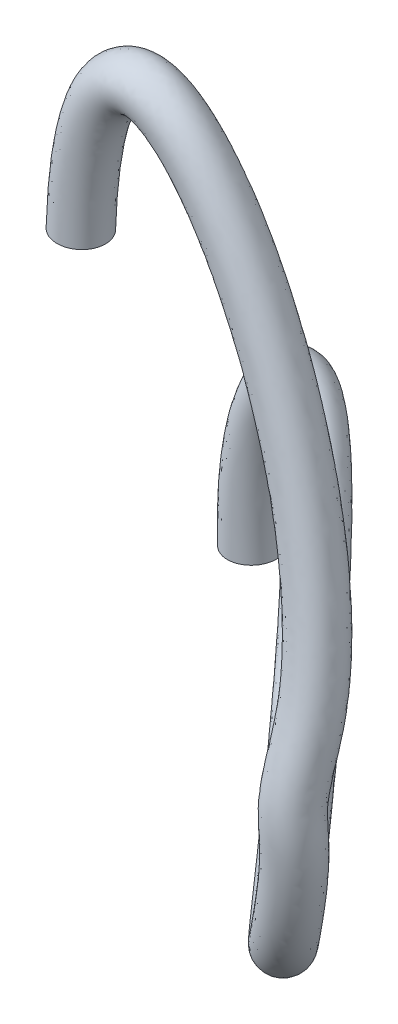
ISO-10303-21;
HEADER;
FILE_DESCRIPTION(('STEP AP214'),'2;1');
FILE_NAME('part.step','',(''),(''),'','','');
FILE_SCHEMA(('AUTOMOTIVE_DESIGN { 1 0 10303 214 1 1 1 1 }'));
ENDSEC;
DATA;
#1=APPLICATION_CONTEXT('core data for automotive mechanical design processes');
#2=APPLICATION_PROTOCOL_DEFINITION('international standard','automotive_design',2000,#1);
#3=PRODUCT_CONTEXT('',#1,'mechanical');
#4=PRODUCT('Part','Part','',(#3));
#5=PRODUCT_RELATED_PRODUCT_CATEGORY('part','',(#4));
#6=PRODUCT_DEFINITION_FORMATION('','',#4);
#7=PRODUCT_DEFINITION_CONTEXT('part definition',#1,'design');
#8=PRODUCT_DEFINITION('design','',#6,#7);
#9=PRODUCT_DEFINITION_SHAPE('','',#8);
#10=(LENGTH_UNIT() NAMED_UNIT(*) SI_UNIT(.MILLI.,.METRE.));
#11=(NAMED_UNIT(*) PLANE_ANGLE_UNIT() SI_UNIT($,.RADIAN.));
#12=(NAMED_UNIT(*) SI_UNIT($,.STERADIAN.) SOLID_ANGLE_UNIT());
#13=UNCERTAINTY_MEASURE_WITH_UNIT(LENGTH_MEASURE(1.E-05),#10,'distance_accuracy_value','');
#14=(GEOMETRIC_REPRESENTATION_CONTEXT(3) GLOBAL_UNCERTAINTY_ASSIGNED_CONTEXT((#13)) GLOBAL_UNIT_ASSIGNED_CONTEXT((#10,
#11,#12)) REPRESENTATION_CONTEXT('',''));
#15=CARTESIAN_POINT('',(0.,0.,0.));
#16=DIRECTION('',(0.,0.,1.));
#17=DIRECTION('',(1.,0.,0.));
#18=AXIS2_PLACEMENT_3D('',#15,#16,#17);
#19=CARTESIAN_POINT('',(-13.0347942416813,-226.512822725171,50.1244016321392));
#20=DIRECTION('',(-0.0149465818081436,0.999741134294788,0.0171541275273245));
#21=DIRECTION('',(0.,-0.0171560439671148,0.999852824247348));
#22=AXIS2_PLACEMENT_3D('',#19,#20,#21);
#23=PLANE('',#22);
#24=CARTESIAN_POINT('',(-13.0347942416813,-226.512822725171,50.1244016321392));
#25=DIRECTION('',(-0.0149465818081436,0.999741134294788,0.0171541275273245));
#26=DIRECTION('',(0.,-0.0171560439671148,0.999852824247348));
#27=AXIS2_PLACEMENT_3D('',#24,#25,#26);
#28=CIRCLE('',#27,1.);
#29=CARTESIAN_POINT('',(-13.0347942416813,-226.529978769138,51.1242544563865));
#30=VERTEX_POINT('',#29);
#31=EDGE_CURVE('E46',#30,#30,#28,.T.);
#32=ORIENTED_EDGE('',*,*,#31,.F.);
#33=EDGE_LOOP('',(#32));
#34=FACE_BOUND('',#33,.T.);
#35=ADVANCED_FACE('F39',(#34),#23,.F.);
#36=CARTESIAN_POINT('',(-2.46375851643951,-201.319347136881,67.6694839476543));
#37=DIRECTION('',(-0.0315412108607753,-0.999499974804166,0.00222539522531045));
#38=DIRECTION('',(0.744611515704135,-0.0249828471356804,-0.667030395131872));
#39=AXIS2_PLACEMENT_3D('',#36,#37,#38);
#40=PLANE('',#39);
#41=CARTESIAN_POINT('',(-2.46375851643951,-201.319347136881,67.6694839476543));
#42=DIRECTION('',(-0.0315412108607753,-0.999499974804166,0.00222539522531045));
#43=DIRECTION('',(0.744611515704135,-0.0249828471356804,-0.667030395131872));
#44=AXIS2_PLACEMENT_3D('',#41,#42,#43);
#45=CIRCLE('',#44,1.);
#46=CARTESIAN_POINT('',(-1.71914700073537,-201.344329984016,67.0024535525224));
#47=VERTEX_POINT('',#46);
#48=EDGE_CURVE('E12',#47,#47,#45,.T.);
#49=ORIENTED_EDGE('',*,*,#48,.T.);
#50=EDGE_LOOP('',(#49));
#51=FACE_BOUND('',#50,.T.);
#52=ADVANCED_FACE('F53',(#51),#40,.T.);
#53=CARTESIAN_POINT('',(-13.0347942416813,-226.529978769138,51.1242544563865));
#54=CARTESIAN_POINT('',(-13.0440402265788,-225.911536917005,51.1348660332005));
#55=CARTESIAN_POINT('',(-13.0905886557379,-225.33835601833,51.1403298783195));
#56=CARTESIAN_POINT('',(-13.1222589038282,-224.269723785882,51.1400649965788));
#57=CARTESIAN_POINT('',(-13.1193268513688,-223.77513537063,51.1352221258245));
#58=CARTESIAN_POINT('',(-13.0538358420323,-222.400793128945,51.1162792558719));
#59=CARTESIAN_POINT('',(-12.9343080260099,-221.630267988481,51.0975918191668));
#60=CARTESIAN_POINT('',(-12.5449551072193,-220.331490106799,51.1086682537494));
#61=CARTESIAN_POINT('',(-12.2746930525886,-219.802797381809,51.1391130133391));
#62=CARTESIAN_POINT('',(-11.5960889464079,-218.951027552553,51.3076957212363));
#63=CARTESIAN_POINT('',(-11.188919535507,-218.629149988249,51.4460797859978));
#64=CARTESIAN_POINT('',(-10.3939438985895,-218.223194749304,51.8067314344491));
#65=CARTESIAN_POINT('',(-10.0456834613606,-218.17333842022,52.0556527854645));
#66=CARTESIAN_POINT('',(-9.33082928730492,-218.119154898828,52.5873074704543));
#67=CARTESIAN_POINT('',(-8.96149475325939,-218.132644313543,52.8860380455099));
#68=CARTESIAN_POINT('',(-7.82220434450932,-218.26994916006,53.8662674843978));
#69=CARTESIAN_POINT('',(-7.02053406284668,-218.490513535666,54.6320822622825));
#70=CARTESIAN_POINT('',(-4.54053746468336,-219.36420135975,57.1500470705503));
#71=CARTESIAN_POINT('',(-2.78661276719811,-220.230160406775,59.1239600577841));
#72=CARTESIAN_POINT('',(-0.684483190036909,-221.10085375239,61.5451553381744));
#73=CARTESIAN_POINT('',(-0.271939762162594,-221.26877867169,62.0284500369329));
#74=CARTESIAN_POINT('',(0.552679034724152,-221.549682598416,62.9725740666262));
#75=CARTESIAN_POINT('',(0.97304904519423,-221.651671448631,63.4286460022609));
#76=CARTESIAN_POINT('',(2.17066130603324,-221.924015316748,64.7665929061346));
#77=CARTESIAN_POINT('',(2.91311482170818,-222.020938786136,65.6068206621804));
#78=CARTESIAN_POINT('',(4.24368567226437,-221.928181440564,67.0792680928116));
#79=CARTESIAN_POINT('',(4.82751778401289,-221.739711204447,67.7075013062892));
#80=CARTESIAN_POINT('',(5.80433314194947,-221.029504161981,68.688248635818));
#81=CARTESIAN_POINT('',(6.20414193356873,-220.518627743305,69.05084010293));
#82=CARTESIAN_POINT('',(6.69844455369828,-219.365709717696,69.3965638773035));
#83=CARTESIAN_POINT('',(6.84621371959639,-218.914649148087,69.4813960315552));
#84=CARTESIAN_POINT('',(7.07840219514992,-218.010321129344,69.6027472379152));
#85=CARTESIAN_POINT('',(7.16307894714229,-217.555706368157,69.640877464366));
#86=CARTESIAN_POINT('',(7.24831649039113,-216.806837624908,69.6976963846382));
#87=CARTESIAN_POINT('',(7.25026576771351,-216.510044613226,69.7191627660912));
#88=CARTESIAN_POINT('',(7.2260250018249,-215.920644461417,69.732045667745));
#89=CARTESIAN_POINT('',(7.19691416488521,-215.625728654696,69.7233607189164));
#90=CARTESIAN_POINT('',(7.15814221258793,-214.812062757811,69.6123380433563));
#91=CARTESIAN_POINT('',(7.16737619792173,-214.350235493218,69.4890705672554));
#92=CARTESIAN_POINT('',(7.17824686792979,-213.412927459175,69.2120063113031));
#93=CARTESIAN_POINT('',(7.18046279217853,-212.936545042596,69.0603725917556));
#94=CARTESIAN_POINT('',(7.09304744310571,-211.429915980601,68.6134085494747));
#95=CARTESIAN_POINT('',(6.89834668661376,-210.250651014662,68.3504388091575));
#96=CARTESIAN_POINT('',(6.29785667040173,-207.756014551804,67.8952564801486));
#97=CARTESIAN_POINT('',(5.89305230596577,-206.440060183353,67.701675433244));
#98=CARTESIAN_POINT('',(4.47986301821104,-202.549035676534,67.2101323179444));
#99=CARTESIAN_POINT('',(3.27063734802332,-200.020167459974,67.0080984686505));
#100=CARTESIAN_POINT('',(1.5073017297325,-197.42052331265,66.8992600641136));
#101=CARTESIAN_POINT('',(0.920953555696322,-196.757074612486,66.8936024528431));
#102=CARTESIAN_POINT('',(0.209208364146438,-196.214714214967,66.9040458518906));
#103=CARTESIAN_POINT('',(0.00403569124080347,-196.112385474056,66.9103517516525));
#104=CARTESIAN_POINT('',(-0.281016395124792,-196.029962383435,66.9196316060452));
#105=CARTESIAN_POINT('',(-0.348998428634918,-196.036759310006,66.9214024306739));
#106=CARTESIAN_POINT('',(-0.494011792809644,-196.087135522451,66.9264499650434));
#107=CARTESIAN_POINT('',(-0.596476841031181,-196.14747557925,66.9319900333457));
#108=CARTESIAN_POINT('',(-0.868268662130432,-196.512303668752,66.9499476004246));
#109=CARTESIAN_POINT('',(-1.02378041349926,-196.813023855271,66.9612456206987));
#110=CARTESIAN_POINT('',(-1.4413405943594,-198.098725519085,66.9912680626508));
#111=CARTESIAN_POINT('',(-1.65271293970787,-199.454396971032,67.0058291985177));
#112=CARTESIAN_POINT('',(-1.71914700073537,-201.344329984016,67.0024535525224));
#113=CARTESIAN_POINT('',(-11.0350176544673,-226.500090005071,51.1247673048159));
#114=CARTESIAN_POINT('',(-11.0436412741358,-225.923276663833,51.1346645959096));
#115=CARTESIAN_POINT('',(-11.0919714343707,-225.397844163938,51.2541189142139));
#116=CARTESIAN_POINT('',(-11.1479547207428,-224.433021909843,51.4340280816283));
#117=CARTESIAN_POINT('',(-11.1657080298201,-223.995121653065,51.5192839114689));
#118=CARTESIAN_POINT('',(-11.1922097271876,-222.809290499744,51.7624787419387));
#119=CARTESIAN_POINT('',(-11.1719591492084,-222.191067499595,51.9078483259178));
#120=CARTESIAN_POINT('',(-11.1068529808166,-221.257539068218,52.1815992033654));
#121=CARTESIAN_POINT('',(-11.0708219450295,-220.948272128059,52.3086622588021));
#122=CARTESIAN_POINT('',(-11.0167066082903,-220.443407434443,52.5592474875625));
#123=CARTESIAN_POINT('',(-10.9914040660148,-220.227537009934,52.6807901697548));
#124=CARTESIAN_POINT('',(-10.7866542090519,-219.795805270462,53.0042860969341));
#125=CARTESIAN_POINT('',(-10.5490160786025,-219.791294888871,53.1268991032685));
#126=CARTESIAN_POINT('',(-10.0531776322906,-219.753726860478,53.4956482280068));
#127=CARTESIAN_POINT('',(-9.76601904483836,-219.761746269411,53.7264467284955));
#128=CARTESIAN_POINT('',(-8.8230986489472,-219.875397905015,54.5377003088939));
#129=CARTESIAN_POINT('',(-8.08922424843204,-220.071386855849,55.2349156218967));
#130=CARTESIAN_POINT('',(-5.74882352650195,-220.895913605629,57.6111016244487));
#131=CARTESIAN_POINT('',(-4.00498751424553,-221.753356516724,59.5686050819026));
#132=CARTESIAN_POINT('',(-1.86514649387156,-222.639676869289,62.0332123184048));
#133=CARTESIAN_POINT('',(-1.43599683473848,-222.818650524898,62.5220254510434));
#134=CARTESIAN_POINT('',(-0.596347762801169,-223.093245526239,63.5183755164971));
#135=CARTESIAN_POINT('',(-0.192374880904629,-223.15933421881,64.0379518459957));
#136=CARTESIAN_POINT('',(1.02266345847644,-223.383057952354,65.5171592256592));
#137=CARTESIAN_POINT('',(1.81368465051878,-223.472881027047,66.4483230816871));
#138=CARTESIAN_POINT('',(3.32526578562631,-223.334734617192,68.1761374364183));
#139=CARTESIAN_POINT('',(4.05195641740548,-223.109077364268,68.9772124159151));
#140=CARTESIAN_POINT('',(5.38608096291131,-222.115559155016,70.3418432201516));
#141=CARTESIAN_POINT('',(5.98336830199354,-221.332289611366,70.8903992798378));
#142=CARTESIAN_POINT('',(6.64118250327937,-219.770906417923,71.3599296211806));
#143=CARTESIAN_POINT('',(6.81378103387975,-219.236506866723,71.456053252627));
#144=CARTESIAN_POINT('',(7.07677895327758,-218.211961958102,71.5935394824994));
#145=CARTESIAN_POINT('',(7.16666728834131,-217.720605100075,71.6341065104437));
#146=CARTESIAN_POINT('',(7.2546404080098,-216.946148634703,71.6928702996682));
#147=CARTESIAN_POINT('',(7.25902801268548,-216.625232295838,71.7171579489637));
#148=CARTESIAN_POINT('',(7.22949904299832,-215.889951078808,71.7331392544009));
#149=CARTESIAN_POINT('',(7.19029233043493,-215.478511560866,71.7217662784038));
#150=CARTESIAN_POINT('',(7.13757677700508,-214.372174594629,71.5708089464321));
#151=CARTESIAN_POINT('',(7.15066463851672,-213.820451426743,71.4179418195851));
#152=CARTESIAN_POINT('',(7.16215344498885,-212.808991449418,71.1189664710507));
#153=CARTESIAN_POINT('',(7.16922682355933,-212.346497147734,70.9721420585021));
#154=CARTESIAN_POINT('',(7.04195234486364,-211.000488876941,70.5694918702888));
#155=CARTESIAN_POINT('',(6.81658913394438,-209.899065573243,70.3196143049275));
#156=CARTESIAN_POINT('',(6.11870632786456,-207.553094936485,69.8788586422126));
#157=CARTESIAN_POINT('',(5.64732340310487,-206.307772372681,69.6851794225929));
#158=CARTESIAN_POINT('',(4.00204510221432,-202.650576430489,69.1620705467487));
#159=CARTESIAN_POINT('',(2.59836870494429,-200.299728719329,68.8832511213448));
#160=CARTESIAN_POINT('',(0.798945399473573,-198.006228283886,68.6787980013138));
#161=CARTESIAN_POINT('',(0.229850982695869,-197.456354200859,68.6475734187461));
#162=CARTESIAN_POINT('',(-0.262885471335626,-197.131834857028,68.6206629698894));
#163=CARTESIAN_POINT('',(-0.3573377479197,-197.114386355743,68.6141438172107));
#164=CARTESIAN_POINT('',(-0.274892384766118,-197.149162982778,68.5884204691253));
#165=CARTESIAN_POINT('',(-0.0694178066379748,-197.169895592458,68.5663168494106));
#166=CARTESIAN_POINT('',(0.275045456636238,-197.047484996517,68.5246322148988));
#167=CARTESIAN_POINT('',(0.35290765603614,-196.944626689201,68.5104850523792));
#168=CARTESIAN_POINT('',(0.288742385463768,-197.04516608964,68.5010151414328));
#169=CARTESIAN_POINT('',(0.179917043097016,-197.239510552832,68.5029993354389));
#170=CARTESIAN_POINT('',(-0.138587411219462,-198.281054745593,68.508081229056));
#171=CARTESIAN_POINT('',(-0.336364946509854,-199.555944423342,68.5096046115393));
#172=CARTESIAN_POINT('',(-0.385642081062072,-201.38309376688,68.4925079133916));
#173=CARTESIAN_POINT('',(-11.0350176544673,-226.465777917137,49.1250616563212));
#174=CARTESIAN_POINT('',(-11.0435198610858,-225.897085609191,49.1348196021088));
#175=CARTESIAN_POINT('',(-10.977394516447,-225.378845223546,49.2554036540673));
#176=CARTESIAN_POINT('',(-10.8535292839073,-224.44088583759,49.4537242308263));
#177=CARTESIAN_POINT('',(-10.7819973202627,-224.02093050073,49.5544900210702));
#178=CARTESIAN_POINT('',(-10.5518483297245,-222.905122434055,49.8614228062957));
#179=CARTESIAN_POINT('',(-10.3759854715488,-222.355554583336,50.0725747976506));
#180=CARTESIAN_POINT('',(-10.0730985431314,-221.611564218615,50.4978899117022));
#181=CARTESIAN_POINT('',(-9.95577291927319,-221.42406018701,50.7093729947331));
#182=CARTESIAN_POINT('',(-9.83341905834389,-221.198276958803,51.124870504757));
#183=CARTESIAN_POINT('',(-9.81882728172943,-221.137326045333,51.32641317634));
#184=CARTESIAN_POINT('',(-9.70390033264541,-220.983369393498,51.8057273670894));
#185=CARTESIAN_POINT('',(-9.49908496251793,-220.947509146405,51.8772955697118));
#186=CARTESIAN_POINT('',(-9.04549293599418,-220.913127861103,52.2146109050175));
#187=CARTESIAN_POINT('',(-8.7732395955331,-220.920050681934,52.4330259465016));
#188=CARTESIAN_POINT('',(-7.8637067135973,-221.02966007669,53.2155369982789));
#189=CARTESIAN_POINT('',(-7.1378415384819,-221.222126255243,53.9042447185703));
#190=CARTESIAN_POINT('',(-4.80540632515107,-222.043807055532,56.2723089863048));
#191=CARTESIAN_POINT('',(-3.04668966219705,-222.907967410955,58.2451144210213));
#192=CARTESIAN_POINT('',(-0.862884797281233,-223.81247777692,60.7603405412061));
#193=CARTESIAN_POINT('',(-0.416936870212046,-223.986831053487,61.2581211437211));
#194=CARTESIAN_POINT('',(0.430928088401893,-224.292374409552,62.2906225685807));
#195=CARTESIAN_POINT('',(0.809729309050905,-224.416012157669,62.8468975835371));
#196=CARTESIAN_POINT('',(2.02057634155223,-224.732577954875,64.4257309570208));
#197=CARTESIAN_POINT('',(2.84648350294262,-224.857506691555,65.4321086951659));
#198=CARTESIAN_POINT('',(4.50166816629574,-224.743998132683,67.3720185673002));
#199=CARTESIAN_POINT('',(5.3456468119298,-224.505451934472,68.3179481211101));
#200=CARTESIAN_POINT('',(6.97482186955737,-223.307259455286,70.0043837523932));
#201=CARTESIAN_POINT('',(7.73622062918321,-222.310483817955,70.7097353769851));
#202=CARTESIAN_POINT('',(8.53373240097173,-220.424997121676,71.289303127899));
#203=CARTESIAN_POINT('',(8.73127851710219,-219.808115112407,71.3970325334501));
#204=CARTESIAN_POINT('',(9.03558924271676,-218.622670864295,71.5561700323956));
#205=CARTESIAN_POINT('',(9.14132793084536,-218.055591644152,71.6035601811797));
#206=CARTESIAN_POINT('',(9.25445105315488,-217.060195264901,71.6792896297926));
#207=CARTESIAN_POINT('',(9.26018140728588,-216.612261409764,71.7116646004726));
#208=CARTESIAN_POINT('',(9.22494950334605,-215.738358804177,71.7298808743543));
#209=CARTESIAN_POINT('',(9.18495493621358,-215.318878180991,71.7125771870724));
#210=CARTESIAN_POINT('',(9.13957633847308,-214.366514190949,71.5826268435801));
#211=CARTESIAN_POINT('',(9.1503821167828,-213.845149913691,71.4422177482242));
#212=CARTESIAN_POINT('',(9.16205410396982,-212.817653904592,71.1387564447078));
#213=CARTESIAN_POINT('',(9.17043429839942,-212.310568006373,70.9706618761348));
#214=CARTESIAN_POINT('',(9.02952336751602,-210.726395574854,70.5523533683196));
#215=CARTESIAN_POINT('',(8.78206316383374,-209.513546933997,70.3296736211307));
#216=CARTESIAN_POINT('',(8.03521887303571,-206.981905737103,69.9908253173331));
#217=CARTESIAN_POINT('',(7.5350016652325,-205.663503676182,69.8745925481096));
#218=CARTESIAN_POINT('',(5.77411791472216,-201.816955272141,69.633227140584));
#219=CARTESIAN_POINT('',(4.25869682904733,-199.400993919045,69.5946524695872));
#220=CARTESIAN_POINT('',(2.1923877125017,-196.894083668081,69.5948107040025));
#221=CARTESIAN_POINT('',(1.53176011507585,-196.245470421304,69.6093243559149));
#222=CARTESIAN_POINT('',(0.673484886070003,-195.683167629024,69.6434614417508));
#223=CARTESIAN_POINT('',(0.41092074665823,-195.565533601524,69.6566919060507));
#224=CARTESIAN_POINT('',(-0.0398589292564667,-195.468796682912,69.6825870462222));
#225=CARTESIAN_POINT('',(-0.223292310592796,-195.484418666561,69.6947585638888));
#226=CARTESIAN_POINT('',(-0.567147681342547,-195.63289112394,69.7194232259877));
#227=CARTESIAN_POINT('',(-0.737828747352893,-195.77250489401,69.7328235123505));
#228=CARTESIAN_POINT('',(-1.07614493674874,-196.265704225834,69.7608598616881));
#229=CARTESIAN_POINT('',(-1.23820799253575,-196.617772196132,69.7750418285586));
#230=CARTESIAN_POINT('',(-1.65383728663344,-198.021436339936,69.8117427621593));
#231=CARTESIAN_POINT('',(-1.83631569386644,-199.415374093115,69.828296473509));
#232=CARTESIAN_POINT('',(-1.87486511247034,-201.333128072608,69.8265687036553));
#233=CARTESIAN_POINT('',(-13.0347942416813,-226.495666681204,49.1245488078919));
#234=CARTESIAN_POINT('',(-13.0439188135288,-225.88534586238,49.1350210393965));
#235=CARTESIAN_POINT('',(-12.9760117378142,-225.319357077935,49.1416146181737));
#236=CARTESIAN_POINT('',(-12.8278334669927,-224.277587713633,49.1597611457759));
#237=CARTESIAN_POINT('',(-12.7356161418106,-223.800944218299,49.1704282354266));
#238=CARTESIAN_POINT('',(-12.4134744445708,-222.49662506325,49.2152233202273));
#239=CARTESIAN_POINT('',(-12.1383343483526,-221.794755072228,49.2623182908984));
#240=CARTESIAN_POINT('',(-11.5112006695318,-220.685515257191,49.4249589620873));
#241=CARTESIAN_POINT('',(-11.1596440268323,-220.27858544076,49.5398237492719));
#242=CARTESIAN_POINT('',(-10.4128013964615,-219.705897076914,49.873318738429));
#243=CARTESIAN_POINT('',(-10.0163427512217,-219.538939023649,50.0917027925811));
#244=CARTESIAN_POINT('',(-9.31119002218312,-219.41075887234,50.6081727046057));
#245=CARTESIAN_POINT('',(-8.995752345276,-219.329552677757,50.8060492519109));
#246=CARTESIAN_POINT('',(-8.32314459100852,-219.278555899451,51.306270147462));
#247=CARTESIAN_POINT('',(-7.9687153039507,-219.290948726066,51.5926172635125));
#248=CARTESIAN_POINT('',(-6.86281240916631,-219.424211331735,52.5441041737896));
#249=CARTESIAN_POINT('',(-6.06915135289657,-219.64125293506,53.3014113589519));
#250=CARTESIAN_POINT('',(-3.5971202633325,-220.512094809653,55.8112544324148));
#251=CARTESIAN_POINT('',(-1.82831491516829,-221.384771300987,57.8004693969401));
#252=CARTESIAN_POINT('',(0.317778506558047,-222.273654660026,60.2722835609664));
#253=CARTESIAN_POINT('',(0.747120202372859,-222.436959200288,60.7645457296151));
#254=CARTESIAN_POINT('',(1.57995488591814,-222.748811481719,61.7448211187053));
#255=CARTESIAN_POINT('',(1.97515323515404,-222.908349387495,62.2375917398065));
#256=CARTESIAN_POINT('',(3.16857418910039,-223.27353531926,63.6751646374876));
#257=CARTESIAN_POINT('',(3.94591367415398,-223.405564450637,64.5906062756665));
#258=CARTESIAN_POINT('',(5.42008805291178,-223.337444956062,66.2751492236862));
#259=CARTESIAN_POINT('',(6.12120817853721,-223.136085774651,67.0482370114842));
#260=CARTESIAN_POINT('',(7.39307404859554,-222.22120446225,68.3507891680595));
#261=CARTESIAN_POINT('',(7.95699426076534,-221.4968219499,68.8701762000808));
#262=CARTESIAN_POINT('',(8.59099445138727,-220.019800421446,69.3259373840202));
#263=CARTESIAN_POINT('',(8.76371120281883,-219.486257393778,69.4223753123782));
#264=CARTESIAN_POINT('',(9.03721248458911,-218.421030035529,69.5653777878114));
#265=CARTESIAN_POINT('',(9.13773958964634,-217.890692912234,69.610331135102));
#266=CARTESIAN_POINT('',(9.24812713553621,-216.920884255106,69.6841157147626));
#267=CARTESIAN_POINT('',(9.2514191623139,-216.497073727156,69.7136694176013));
#268=CARTESIAN_POINT('',(9.22147546217262,-215.769052186781,69.7287872876973));
#269=CARTESIAN_POINT('',(9.19157677066331,-215.46609527482,69.7141716275828));
#270=CARTESIAN_POINT('',(9.16014177405668,-214.806402354131,69.6241559405073));
#271=CARTESIAN_POINT('',(9.16709367618694,-214.374933980167,69.5133464958961));
#272=CARTESIAN_POINT('',(9.17814752691162,-213.421589914349,69.2317962849585));
#273=CARTESIAN_POINT('',(9.18167026701861,-212.900615901238,69.0588924093845));
#274=CARTESIAN_POINT('',(9.08061846575809,-211.155822678506,68.5962700475134));
#275=CARTESIAN_POINT('',(8.86382071650312,-209.865132375406,68.3604981253653));
#276=CARTESIAN_POINT('',(8.21436921557287,-207.184825352431,68.0072231552646));
#277=CARTESIAN_POINT('',(7.78073056809585,-205.795791486874,67.8910885587656));
#278=CARTESIAN_POINT('',(6.25193583071395,-201.715414518147,67.6812889117699));
#279=CARTESIAN_POINT('',(4.93096547211871,-199.12143265972,67.7194998169006));
#280=CARTESIAN_POINT('',(2.90074404276443,-196.308378696829,67.8152727667985));
#281=CARTESIAN_POINT('',(2.22286268807112,-195.546190832931,67.8553533900093));
#282=CARTESIAN_POINT('',(1.14557872155461,-194.766046986962,67.9268443237533));
#283=CARTESIAN_POINT('',(0.772294185822705,-194.563532719833,67.9528998404925));
#284=CARTESIAN_POINT('',(-0.0459829396191129,-194.349596083574,68.0137981831421));
#285=CARTESIAN_POINT('',(-0.502872932591611,-194.351282384111,68.049844145153));
#286=CARTESIAN_POINT('',(-1.33620493078667,-194.672541649873,68.1212409761314));
#287=CARTESIAN_POINT('',(-1.68721324441542,-194.975353784057,68.1543284933157));
#288=CARTESIAN_POINT('',(-2.23315598434779,-195.732841804948,68.2097923206811));
#289=CARTESIAN_POINT('',(-2.44190544913023,-196.191285498571,68.2332881138149));
#290=CARTESIAN_POINT('',(-2.95659046977692,-197.839107113428,68.2949295957612));
#291=CARTESIAN_POINT('',(-3.1526636870611,-199.313826640872,68.3245210605075));
#292=CARTESIAN_POINT('',(-3.20837003214364,-201.294364289745,68.3365143427861));
#293=CARTESIAN_POINT('',(-15.0345708288952,-226.525555445272,49.1240359594625));
#294=CARTESIAN_POINT('',(-15.0443177659717,-225.873606115569,49.1352224766841));
#295=CARTESIAN_POINT('',(-14.9746289591814,-225.259868932324,49.0278255822802));
#296=CARTESIAN_POINT('',(-14.8021376500781,-224.114289589676,48.8657980607255));
#297=CARTESIAN_POINT('',(-14.6892349633586,-223.580957935867,48.786366449783));
#298=CARTESIAN_POINT('',(-14.2751005594172,-222.088127692446,48.569023834159));
#299=CARTESIAN_POINT('',(-13.9006832251565,-221.233955561119,48.4520617841462));
#300=CARTESIAN_POINT('',(-12.9493027959323,-219.759466295768,48.3520280124725));
#301=CARTESIAN_POINT('',(-12.3635151343914,-219.133110694511,48.3702745038107));
#302=CARTESIAN_POINT('',(-10.9921837345791,-218.213517195024,48.6217669721009));
#303=CARTESIAN_POINT('',(-10.213858220714,-217.940552001965,48.8569924088222));
#304=CARTESIAN_POINT('',(-8.91847971172083,-217.838148351181,49.410618042122));
#305=CARTESIAN_POINT('',(-8.492419728034,-217.711596209109,49.73480293411));
#306=CARTESIAN_POINT('',(-7.60079624602277,-217.643983937798,50.3979293899064));
#307=CARTESIAN_POINT('',(-7.16419101236833,-217.661846770198,50.7522085805233));
#308=CARTESIAN_POINT('',(-5.86191810473533,-217.81876258678,51.8726713493004));
#309=CARTESIAN_POINT('',(-5.00046116731127,-218.060379614877,52.6985779993336));
#310=CARTESIAN_POINT('',(-2.38883420151397,-218.980382563774,55.3501998785248));
#311=CARTESIAN_POINT('',(-0.609940168139527,-219.86157519102,57.3558243728589));
#312=CARTESIAN_POINT('',(1.49844181039733,-220.734831543132,59.7842265807267));
#313=CARTESIAN_POINT('',(1.91117727495779,-220.887087347089,60.2709703155091));
#314=CARTESIAN_POINT('',(2.72898168343441,-221.205248553887,61.1990196688298));
#315=CARTESIAN_POINT('',(3.14057716125717,-221.400686617321,61.6282858960759));
#316=CARTESIAN_POINT('',(4.31657203664856,-221.814492683646,62.9245983179544));
#317=CARTESIAN_POINT('',(5.04534384536536,-221.953622209719,63.7491038561671));
#318=CARTESIAN_POINT('',(6.33850793952784,-221.930891779441,65.1782798800722));
#319=CARTESIAN_POINT('',(6.89676954514459,-221.76671961483,65.7785259018582));
#320=CARTESIAN_POINT('',(7.81132622763367,-221.135149469214,66.6971945837258));
#321=CARTESIAN_POINT('',(8.17776789234745,-220.683160081846,67.0306170231764));
#322=CARTESIAN_POINT('',(8.64825650180279,-219.614603721215,67.3625716401413));
#323=CARTESIAN_POINT('',(8.79614388853544,-219.164399675149,67.4477180913064));
#324=CARTESIAN_POINT('',(9.03883572646142,-218.219389206764,67.5745855432271));
#325=CARTESIAN_POINT('',(9.13415124844733,-217.725794180316,67.6171020890244));
#326=CARTESIAN_POINT('',(9.24180321791754,-216.781573245311,67.6889417997326));
#327=CARTESIAN_POINT('',(9.24265691734192,-216.381886044549,67.7156742347299));
#328=CARTESIAN_POINT('',(9.21800142099919,-215.799745569385,67.7276937010402));
#329=CARTESIAN_POINT('',(9.19819860511305,-215.61331236865,67.7157660680932));
#330=CARTESIAN_POINT('',(9.18070720964027,-215.246290517312,67.6656850374344));
#331=CARTESIAN_POINT('',(9.18380523559109,-214.904718046643,67.584475243568));
#332=CARTESIAN_POINT('',(9.19424094985342,-214.025525924106,67.3248361252092));
#333=CARTESIAN_POINT('',(9.1929062356378,-213.490663796103,67.1471229426342));
#334=CARTESIAN_POINT('',(9.13171356400015,-211.585249782158,66.6401867267073));
#335=CARTESIAN_POINT('',(8.9455782691725,-210.216717816816,66.3913226296));
#336=CARTESIAN_POINT('',(8.39351955811004,-207.387744967759,66.023620993196));
#337=CARTESIAN_POINT('',(8.02645947095919,-205.928079297565,65.9075845694217));
#338=CARTESIAN_POINT('',(6.72975374670572,-201.613873764153,65.7293506829558));
#339=CARTESIAN_POINT('',(5.60323411519008,-198.841871400396,65.844347164214));
#340=CARTESIAN_POINT('',(3.60910037302717,-195.722673725578,66.0357348295945));
#341=CARTESIAN_POINT('',(2.91396526106645,-194.846911244558,66.1013824241037));
#342=CARTESIAN_POINT('',(1.61767255703928,-193.848926344901,66.2102272057558));
#343=CARTESIAN_POINT('',(1.13366762498718,-193.561531838142,66.2491077749342));
#344=CARTESIAN_POINT('',(-0.0521069499817591,-193.230395484236,66.3450093200619));
#345=CARTESIAN_POINT('',(-0.782453554590346,-193.21814610166,66.4049297264172));
#346=CARTESIAN_POINT('',(-2.1052621802307,-193.712192175805,66.5230587262751));
#347=CARTESIAN_POINT('',(-2.63659774147791,-194.178202674105,66.575833474281));
#348=CARTESIAN_POINT('',(-3.39016703194682,-195.199979384062,66.6587247796741));
#349=CARTESIAN_POINT('',(-3.64560290572469,-195.764798801011,66.691534399071));
#350=CARTESIAN_POINT('',(-4.25934365292039,-197.656777886921,66.778116429363));
#351=CARTESIAN_POINT('',(-4.46901168025575,-199.212279188629,66.8207456475061));
#352=CARTESIAN_POINT('',(-4.54187495181693,-201.255600506882,66.846459981917));
#353=CARTESIAN_POINT('',(-15.0345708288952,-226.559867533206,51.1237416079572));
#354=CARTESIAN_POINT('',(-15.0444391790217,-225.899797170177,51.1350674704913));
#355=CARTESIAN_POINT('',(-15.0892058771051,-225.278867872723,51.026540842425));
#356=CARTESIAN_POINT('',(-15.0965630869136,-224.106425661921,50.8461019115293));
#357=CARTESIAN_POINT('',(-15.0729456729176,-223.555149088195,50.7511603401801));
#358=CARTESIAN_POINT('',(-14.9154619568771,-221.992295758147,50.4700797698052));
#359=CARTESIAN_POINT('',(-14.6966569028115,-221.069468477368,50.2873353124157));
#360=CARTESIAN_POINT('',(-13.983057233622,-219.405441145381,50.0357373041334));
#361=CARTESIAN_POINT('',(-13.4785641601477,-218.65732263556,49.9695637678761));
#362=CARTESIAN_POINT('',(-12.1754712845255,-217.458647670664,50.0561439549101));
#363=CARTESIAN_POINT('',(-11.3864350049993,-217.030762966565,50.2113694022407));
#364=CARTESIAN_POINT('',(-10.0012335881273,-216.650584228146,50.6091767719641));
#365=CARTESIAN_POINT('',(-9.54235084411858,-216.555381951569,50.9844064676606));
#366=CARTESIAN_POINT('',(-8.6084809423192,-216.484582937179,51.6789667129017));
#367=CARTESIAN_POINT('',(-8.15697046168043,-216.503542357675,52.0456293625241));
#368=CARTESIAN_POINT('',(-6.82131004007144,-216.664500415105,53.1948346599016));
#369=CARTESIAN_POINT('',(-5.95184387726138,-216.909640215483,54.0292489026684));
#370=CARTESIAN_POINT('',(-3.33225140286483,-217.832489113871,56.6889925166519));
#371=CARTESIAN_POINT('',(-1.56823802015071,-218.706964296826,58.6793150336656));
#372=CARTESIAN_POINT('',(0.496180113797712,-219.562030635491,61.057098357944));
#373=CARTESIAN_POINT('',(0.892117310413263,-219.718906818481,61.5348746228224));
#374=CARTESIAN_POINT('',(1.70170583224945,-220.006119670592,62.4267726167552));
#375=CARTESIAN_POINT('',(2.13847297129303,-220.144008678453,62.819340158526));
#376=CARTESIAN_POINT('',(3.31865915358998,-220.464972681143,64.01602658661));
#377=CARTESIAN_POINT('',(4.01254499289754,-220.568996545226,64.7653182426737));
#378=CARTESIAN_POINT('',(5.1621055589024,-220.521628263936,65.982398749205));
#379=CARTESIAN_POINT('',(5.60307915062027,-220.370345044626,66.4377901966632));
#380=CARTESIAN_POINT('',(6.2225853209876,-219.943449168945,67.0346540514843));
#381=CARTESIAN_POINT('',(6.42491556514392,-219.704965875244,67.2112809260222));
#382=CARTESIAN_POINT('',(6.7557066041172,-218.960513017469,67.4331981334264));
#383=CARTESIAN_POINT('',(6.878646405313,-218.592791429451,67.5067388104833));
#384=CARTESIAN_POINT('',(7.08002543702223,-217.808680300586,67.611954993331));
#385=CARTESIAN_POINT('',(7.15949060594328,-217.390807636239,67.6476484182883));
#386=CARTESIAN_POINT('',(7.24199257277245,-216.667526615113,67.7025224696083));
#387=CARTESIAN_POINT('',(7.24150352274152,-216.394856930614,67.7211675832187));
#388=CARTESIAN_POINT('',(7.22255096065146,-215.951337844026,67.7309520810891));
#389=CARTESIAN_POINT('',(7.20353599933549,-215.772945748525,67.724955159429));
#390=CARTESIAN_POINT('',(7.17870764817078,-215.251950920993,67.6538671402804));
#391=CARTESIAN_POINT('',(7.18408775732673,-214.880019559695,67.5601993149256));
#392=CARTESIAN_POINT('',(7.19434029087074,-214.016863468932,67.3050461515555));
#393=CARTESIAN_POINT('',(7.19169876079772,-213.526592937457,67.1486031250092));
#394=CARTESIAN_POINT('',(7.14414254134778,-211.859343084261,66.6573252286607));
#395=CARTESIAN_POINT('',(6.98010423928314,-210.602236456081,66.3812633133875));
#396=CARTESIAN_POINT('',(6.4770070129389,-207.958934167122,65.9116543180847));
#397=CARTESIAN_POINT('',(6.13878120882665,-206.572347994024,65.7181714438952));
#398=CARTESIAN_POINT('',(4.95768093420775,-202.44749492258,65.2581940891402));
#399=CARTESIAN_POINT('',(3.9429059911023,-199.740606200618,65.1329458159563));
#400=CARTESIAN_POINT('',(2.21565805999137,-196.834818341414,65.1197221269134));
#401=CARTESIAN_POINT('',(1.61205612869677,-196.057795024113,65.13963148694));
#402=CARTESIAN_POINT('',(0.681302199628503,-195.297593572906,65.1874287338919));
#403=CARTESIAN_POINT('',(0.365409130401309,-195.110384592369,65.2065596860942));
#404=CARTESIAN_POINT('',(-0.287140405483468,-194.910761784093,65.250842742965));
#405=CARTESIAN_POINT('',(-0.628579050631885,-194.903623027554,65.2764880119372));
#406=CARTESIAN_POINT('',(-1.26306904225556,-195.126786048385,65.328267715188));
#407=CARTESIAN_POINT('',(-1.5458613380985,-195.3503244693,65.3534950143121));
#408=CARTESIAN_POINT('',(-2.02527970972463,-195.979441247863,65.3988800594164));
#409=CARTESIAN_POINT('',(-2.2274778700955,-196.386537157711,65.4194919059584));
#410=CARTESIAN_POINT('',(-2.74409377749931,-197.916396292578,65.4744548962455));
#411=CARTESIAN_POINT('',(-2.96906093290589,-199.352849518722,65.5020537854961));
#412=CARTESIAN_POINT('',(-3.05265192040867,-201.305566201153,65.5123991916532));
#413=CARTESIAN_POINT('',(-13.0347942416813,-226.529978769138,51.1242544563865));
#414=CARTESIAN_POINT('',(-13.0440402265788,-225.911536917005,51.1348660332005));
#415=CARTESIAN_POINT('',(-13.0905886557379,-225.33835601833,51.1403298783195));
#416=CARTESIAN_POINT('',(-13.1222589038282,-224.269723785882,51.1400649965788));
#417=CARTESIAN_POINT('',(-13.1193268513688,-223.77513537063,51.1352221258245));
#418=CARTESIAN_POINT('',(-13.0538358420323,-222.400793128945,51.1162792558719));
#419=CARTESIAN_POINT('',(-12.9343080260099,-221.630267988481,51.0975918191668));
#420=CARTESIAN_POINT('',(-12.5449551072193,-220.331490106799,51.1086682537494));
#421=CARTESIAN_POINT('',(-12.2746930525886,-219.802797381809,51.1391130133391));
#422=CARTESIAN_POINT('',(-11.5960889464079,-218.951027552553,51.3076957212363));
#423=CARTESIAN_POINT('',(-11.188919535507,-218.629149988249,51.4460797859978));
#424=CARTESIAN_POINT('',(-10.3939438985895,-218.223194749304,51.8067314344491));
#425=CARTESIAN_POINT('',(-10.0456834613606,-218.17333842022,52.0556527854645));
#426=CARTESIAN_POINT('',(-9.33082928730492,-218.119154898828,52.5873074704543));
#427=CARTESIAN_POINT('',(-8.96149475325939,-218.132644313543,52.8860380455099));
#428=CARTESIAN_POINT('',(-7.82220434450932,-218.26994916006,53.8662674843978));
#429=CARTESIAN_POINT('',(-7.02053406284668,-218.490513535666,54.6320822622825));
#430=CARTESIAN_POINT('',(-4.54053746468336,-219.36420135975,57.1500470705503));
#431=CARTESIAN_POINT('',(-2.78661276719811,-220.230160406775,59.1239600577841));
#432=CARTESIAN_POINT('',(-0.684483190036909,-221.10085375239,61.5451553381744));
#433=CARTESIAN_POINT('',(-0.271939762162594,-221.26877867169,62.0284500369329));
#434=CARTESIAN_POINT('',(0.552679034724152,-221.549682598416,62.9725740666262));
#435=CARTESIAN_POINT('',(0.97304904519423,-221.651671448631,63.4286460022609));
#436=CARTESIAN_POINT('',(2.17066130603324,-221.924015316748,64.7665929061346));
#437=CARTESIAN_POINT('',(2.91311482170818,-222.020938786136,65.6068206621804));
#438=CARTESIAN_POINT('',(4.24368567226437,-221.928181440564,67.0792680928116));
#439=CARTESIAN_POINT('',(4.82751778401289,-221.739711204447,67.7075013062892));
#440=CARTESIAN_POINT('',(5.80433314194947,-221.029504161981,68.688248635818));
#441=CARTESIAN_POINT('',(6.20414193356873,-220.518627743305,69.05084010293));
#442=CARTESIAN_POINT('',(6.69844455369828,-219.365709717696,69.3965638773035));
#443=CARTESIAN_POINT('',(6.84621371959639,-218.914649148087,69.4813960315552));
#444=CARTESIAN_POINT('',(7.07840219514992,-218.010321129344,69.6027472379152));
#445=CARTESIAN_POINT('',(7.16307894714229,-217.555706368157,69.640877464366));
#446=CARTESIAN_POINT('',(7.24831649039113,-216.806837624908,69.6976963846382));
#447=CARTESIAN_POINT('',(7.25026576771351,-216.510044613226,69.7191627660912));
#448=CARTESIAN_POINT('',(7.2260250018249,-215.920644461417,69.732045667745));
#449=CARTESIAN_POINT('',(7.19691416488521,-215.625728654696,69.7233607189164));
#450=CARTESIAN_POINT('',(7.15814221258793,-214.812062757811,69.6123380433563));
#451=CARTESIAN_POINT('',(7.16737619792173,-214.350235493218,69.4890705672554));
#452=CARTESIAN_POINT('',(7.17824686792979,-213.412927459175,69.2120063113031));
#453=CARTESIAN_POINT('',(7.18046279217853,-212.936545042596,69.0603725917556));
#454=CARTESIAN_POINT('',(7.09304744310571,-211.429915980601,68.6134085494747));
#455=CARTESIAN_POINT('',(6.89834668661376,-210.250651014662,68.3504388091575));
#456=CARTESIAN_POINT('',(6.29785667040173,-207.756014551804,67.8952564801486));
#457=CARTESIAN_POINT('',(5.89305230596577,-206.440060183353,67.701675433244));
#458=CARTESIAN_POINT('',(4.47986301821104,-202.549035676534,67.2101323179444));
#459=CARTESIAN_POINT('',(3.27063734802332,-200.020167459974,67.0080984686505));
#460=CARTESIAN_POINT('',(1.5073017297325,-197.42052331265,66.8992600641136));
#461=CARTESIAN_POINT('',(0.920953555696322,-196.757074612486,66.8936024528431));
#462=CARTESIAN_POINT('',(0.209208364146438,-196.214714214967,66.9040458518906));
#463=CARTESIAN_POINT('',(0.00403569124080347,-196.112385474056,66.9103517516525));
#464=CARTESIAN_POINT('',(-0.281016395124792,-196.029962383435,66.9196316060452));
#465=CARTESIAN_POINT('',(-0.348998428634918,-196.036759310006,66.9214024306739));
#466=CARTESIAN_POINT('',(-0.494011792809644,-196.087135522451,66.9264499650434));
#467=CARTESIAN_POINT('',(-0.596476841031181,-196.14747557925,66.9319900333457));
#468=CARTESIAN_POINT('',(-0.868268662130432,-196.512303668752,66.9499476004246));
#469=CARTESIAN_POINT('',(-1.02378041349926,-196.813023855271,66.9612456206987));
#470=CARTESIAN_POINT('',(-1.4413405943594,-198.098725519085,66.9912680626508));
#471=CARTESIAN_POINT('',(-1.65271293970787,-199.454396971032,67.0058291985177));
#472=CARTESIAN_POINT('',(-1.71914700073537,-201.344329984016,67.0024535525224));
#473=(BOUNDED_SURFACE() B_SPLINE_SURFACE(3,3,((#53,#54,#55,#56,#57,#58,#59,#60,#61,#62,#63,#64,
#65,#66,#67,#68,#69,#70,#71,#72,#73,#74,#75,#76,#77,#78,#79,#80,#81,#82,#83,#84,#85,#86,#87,#88,
#89,#90,#91,#92,#93,#94,#95,#96,#97,#98,#99,#100,#101,#102,#103,#104,#105,#106,#107,#108,#109,
#110,#111,#112),(#113,#114,#115,#116,#117,#118,#119,#120,#121,#122,#123,#124,#125,#126,#127,
#128,#129,#130,#131,#132,#133,#134,#135,#136,#137,#138,#139,#140,#141,#142,#143,#144,#145,#146,
#147,#148,#149,#150,#151,#152,#153,#154,#155,#156,#157,#158,#159,#160,#161,#162,#163,#164,#165,
#166,#167,#168,#169,#170,#171,#172),(#173,#174,#175,#176,#177,#178,#179,#180,#181,#182,#183,
#184,#185,#186,#187,#188,#189,#190,#191,#192,#193,#194,#195,#196,#197,#198,#199,#200,#201,#202,
#203,#204,#205,#206,#207,#208,#209,#210,#211,#212,#213,#214,#215,#216,#217,#218,#219,#220,#221,
#222,#223,#224,#225,#226,#227,#228,#229,#230,#231,#232),(#233,#234,#235,#236,#237,#238,#239,
#240,#241,#242,#243,#244,#245,#246,#247,#248,#249,#250,#251,#252,#253,#254,#255,#256,#257,#258,
#259,#260,#261,#262,#263,#264,#265,#266,#267,#268,#269,#270,#271,#272,#273,#274,#275,#276,#277,
#278,#279,#280,#281,#282,#283,#284,#285,#286,#287,#288,#289,#290,#291,#292),(#293,#294,#295,
#296,#297,#298,#299,#300,#301,#302,#303,#304,#305,#306,#307,#308,#309,#310,#311,#312,#313,#314,
#315,#316,#317,#318,#319,#320,#321,#322,#323,#324,#325,#326,#327,#328,#329,#330,#331,#332,#333,
#334,#335,#336,#337,#338,#339,#340,#341,#342,#343,#344,#345,#346,#347,#348,#349,#350,#351,#352),
(#353,#354,#355,#356,#357,#358,#359,#360,#361,#362,#363,#364,#365,#366,#367,#368,#369,#370,#371,
#372,#373,#374,#375,#376,#377,#378,#379,#380,#381,#382,#383,#384,#385,#386,#387,#388,#389,#390,
#391,#392,#393,#394,#395,#396,#397,#398,#399,#400,#401,#402,#403,#404,#405,#406,#407,#408,#409,
#410,#411,#412),(#413,#414,#415,#416,#417,#418,#419,#420,#421,#422,#423,#424,#425,#426,#427,
#428,#429,#430,#431,#432,#433,#434,#435,#436,#437,#438,#439,#440,#441,#442,#443,#444,#445,#446,
#447,#448,#449,#450,#451,#452,#453,#454,#455,#456,#457,#458,#459,#460,#461,#462,#463,#464,#465,
#466,#467,#468,#469,#470,#471,#472)),.UNSPECIFIED.,.T.,.F.,.F.) B_SPLINE_SURFACE_WITH_KNOTS((4,
3,4),(4,2,2,2,2,2,2,2,2,2,2,2,2,2,2,2,2,2,2,2,2,2,2,2,2,2,2,2,2,4),(0.,0.5,1.),(0.,
0.0138132932973199,0.0276265865946397,0.0552531731892795,0.0828797597839192,0.110506346378559,
0.130414146529531,0.150321946680503,0.190137546982446,0.269768747586334,0.289676547737306,
0.309584347888278,0.349399948190221,0.389215548492165,0.429031148794109,0.448331890701393,
0.467632632608677,0.48693337451596,0.506234116423244,0.533012976747897,0.559791837072549,
0.614817857438481,0.669843877804412,0.779895918536275,0.834921938902206,0.862434949085172,
0.889947959268137,0.917460969451103,0.944973979634069,1.),
.UNSPECIFIED.) GEOMETRIC_REPRESENTATION_ITEM() RATIONAL_B_SPLINE_SURFACE(((1.,1.,1.,1.,1.,1.,1.,
1.,1.,1.,1.,1.,1.,1.,1.,1.,1.,1.,1.,1.,1.,1.,1.,1.,1.,1.,1.,1.,1.,1.,1.,1.,1.,1.,1.,1.,1.,1.,1.,
1.,1.,1.,1.,1.,1.,1.,1.,1.,1.,1.,1.,1.,1.,1.,1.,1.,1.,1.,1.,1.),(0.333333333333333,
0.333333333333333,0.333333333333333,0.333333333333333,0.333333333333333,0.333333333333333,
0.333333333333333,0.333333333333333,0.333333333333333,0.333333333333333,0.333333333333333,
0.333333333333333,0.333333333333333,0.333333333333333,0.333333333333333,0.333333333333333,
0.333333333333333,0.333333333333333,0.333333333333333,0.333333333333333,0.333333333333333,
0.333333333333333,0.333333333333333,0.333333333333333,0.333333333333333,0.333333333333333,
0.333333333333333,0.333333333333333,0.333333333333333,0.333333333333333,0.333333333333333,
0.333333333333333,0.333333333333333,0.333333333333333,0.333333333333333,0.333333333333333,
0.333333333333333,0.333333333333333,0.333333333333333,0.333333333333333,0.333333333333333,
0.333333333333333,0.333333333333333,0.333333333333333,0.333333333333333,0.333333333333333,
0.333333333333333,0.333333333333333,0.333333333333333,0.333333333333333,0.333333333333333,
0.333333333333333,0.333333333333333,0.333333333333333,0.333333333333333,0.333333333333333,
0.333333333333333,0.333333333333333,0.333333333333333,0.333333333333333),(0.333333333333333,
0.333333333333333,0.333333333333333,0.333333333333333,0.333333333333333,0.333333333333333,
0.333333333333333,0.333333333333333,0.333333333333333,0.333333333333333,0.333333333333333,
0.333333333333333,0.333333333333333,0.333333333333333,0.333333333333333,0.333333333333333,
0.333333333333333,0.333333333333333,0.333333333333333,0.333333333333333,0.333333333333333,
0.333333333333333,0.333333333333333,0.333333333333333,0.333333333333333,0.333333333333333,
0.333333333333333,0.333333333333333,0.333333333333333,0.333333333333333,0.333333333333333,
0.333333333333333,0.333333333333333,0.333333333333333,0.333333333333333,0.333333333333333,
0.333333333333333,0.333333333333333,0.333333333333333,0.333333333333333,0.333333333333333,
0.333333333333333,0.333333333333333,0.333333333333333,0.333333333333333,0.333333333333333,
0.333333333333333,0.333333333333333,0.333333333333333,0.333333333333333,0.333333333333333,
0.333333333333333,0.333333333333333,0.333333333333333,0.333333333333333,0.333333333333333,
0.333333333333333,0.333333333333333,0.333333333333333,0.333333333333333),(1.,1.,1.,1.,1.,1.,1.,
1.,1.,1.,1.,1.,1.,1.,1.,1.,1.,1.,1.,1.,1.,1.,1.,1.,1.,1.,1.,1.,1.,1.,1.,1.,1.,1.,1.,1.,1.,1.,1.,
1.,1.,1.,1.,1.,1.,1.,1.,1.,1.,1.,1.,1.,1.,1.,1.,1.,1.,1.,1.,1.),(0.333333333333333,
0.333333333333333,0.333333333333333,0.333333333333333,0.333333333333333,0.333333333333333,
0.333333333333333,0.333333333333333,0.333333333333333,0.333333333333333,0.333333333333333,
0.333333333333333,0.333333333333333,0.333333333333333,0.333333333333333,0.333333333333333,
0.333333333333333,0.333333333333333,0.333333333333333,0.333333333333333,0.333333333333333,
0.333333333333333,0.333333333333333,0.333333333333333,0.333333333333333,0.333333333333333,
0.333333333333333,0.333333333333333,0.333333333333333,0.333333333333333,0.333333333333333,
0.333333333333333,0.333333333333333,0.333333333333333,0.333333333333333,0.333333333333333,
0.333333333333333,0.333333333333333,0.333333333333333,0.333333333333333,0.333333333333333,
0.333333333333333,0.333333333333333,0.333333333333333,0.333333333333333,0.333333333333333,
0.333333333333333,0.333333333333333,0.333333333333333,0.333333333333333,0.333333333333333,
0.333333333333333,0.333333333333333,0.333333333333333,0.333333333333333,0.333333333333333,
0.333333333333333,0.333333333333333,0.333333333333333,0.333333333333333),(0.333333333333333,
0.333333333333333,0.333333333333333,0.333333333333333,0.333333333333333,0.333333333333333,
0.333333333333333,0.333333333333333,0.333333333333333,0.333333333333333,0.333333333333333,
0.333333333333333,0.333333333333333,0.333333333333333,0.333333333333333,0.333333333333333,
0.333333333333333,0.333333333333333,0.333333333333333,0.333333333333333,0.333333333333333,
0.333333333333333,0.333333333333333,0.333333333333333,0.333333333333333,0.333333333333333,
0.333333333333333,0.333333333333333,0.333333333333333,0.333333333333333,0.333333333333333,
0.333333333333333,0.333333333333333,0.333333333333333,0.333333333333333,0.333333333333333,
0.333333333333333,0.333333333333333,0.333333333333333,0.333333333333333,0.333333333333333,
0.333333333333333,0.333333333333333,0.333333333333333,0.333333333333333,0.333333333333333,
0.333333333333333,0.333333333333333,0.333333333333333,0.333333333333333,0.333333333333333,
0.333333333333333,0.333333333333333,0.333333333333333,0.333333333333333,0.333333333333333,
0.333333333333333,0.333333333333333,0.333333333333333,0.333333333333333),(1.,1.,1.,1.,1.,1.,1.,
1.,1.,1.,1.,1.,1.,1.,1.,1.,1.,1.,1.,1.,1.,1.,1.,1.,1.,1.,1.,1.,1.,1.,1.,1.,1.,1.,1.,1.,1.,1.,1.,
1.,1.,1.,1.,1.,1.,1.,1.,1.,1.,1.,1.,1.,1.,1.,1.,1.,1.,1.,1.,1.))) REPRESENTATION_ITEM('') SURFACE());
#474=ORIENTED_EDGE('',*,*,#48,.F.);
#475=EDGE_LOOP('',(#474));
#476=FACE_BOUND('',#475,.T.);
#477=ORIENTED_EDGE('',*,*,#31,.T.);
#478=EDGE_LOOP('',(#477));
#479=FACE_BOUND('',#478,.T.);
#480=ADVANCED_FACE('F55',(#476,#479),#473,.T.);
#481=CLOSED_SHELL('',(#35,#52,#480));
#482=MANIFOLD_SOLID_BREP('B2',#481);
#483=ADVANCED_BREP_SHAPE_REPRESENTATION('',(#18,#482),#14);
#484=SHAPE_DEFINITION_REPRESENTATION(#9,#483);
ENDSEC;
END-ISO-10303-21;
